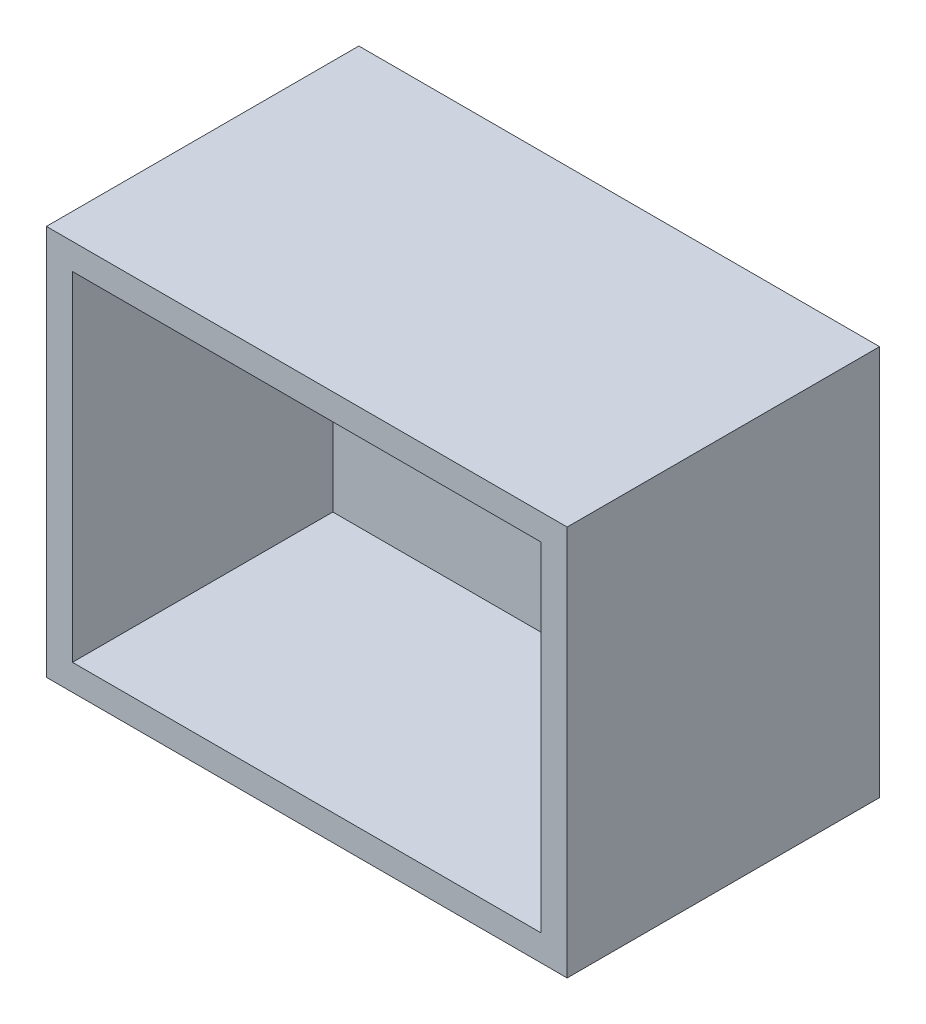
ISO-10303-21;
HEADER;
FILE_DESCRIPTION(('STEP AP214'),'2;1');
FILE_NAME('part.step','',(''),(''),'','','');
FILE_SCHEMA(('AUTOMOTIVE_DESIGN { 1 0 10303 214 1 1 1 1 }'));
ENDSEC;
DATA;
#1=APPLICATION_CONTEXT('core data for automotive mechanical design processes');
#2=APPLICATION_PROTOCOL_DEFINITION('international standard','automotive_design',2000,#1);
#3=PRODUCT_CONTEXT('',#1,'mechanical');
#4=PRODUCT('Part','Part','',(#3));
#5=PRODUCT_RELATED_PRODUCT_CATEGORY('part','',(#4));
#6=PRODUCT_DEFINITION_FORMATION('','',#4);
#7=PRODUCT_DEFINITION_CONTEXT('part definition',#1,'design');
#8=PRODUCT_DEFINITION('design','',#6,#7);
#9=PRODUCT_DEFINITION_SHAPE('','',#8);
#10=(LENGTH_UNIT() NAMED_UNIT(*) SI_UNIT(.MILLI.,.METRE.));
#11=(NAMED_UNIT(*) PLANE_ANGLE_UNIT() SI_UNIT($,.RADIAN.));
#12=(NAMED_UNIT(*) SI_UNIT($,.STERADIAN.) SOLID_ANGLE_UNIT());
#13=UNCERTAINTY_MEASURE_WITH_UNIT(LENGTH_MEASURE(1.E-05),#10,'distance_accuracy_value','');
#14=(GEOMETRIC_REPRESENTATION_CONTEXT(3) GLOBAL_UNCERTAINTY_ASSIGNED_CONTEXT((#13)) GLOBAL_UNIT_ASSIGNED_CONTEXT((#10,
#11,#12)) REPRESENTATION_CONTEXT('',''));
#15=CARTESIAN_POINT('',(0.,0.,0.));
#16=DIRECTION('',(0.,0.,1.));
#17=DIRECTION('',(1.,0.,0.));
#18=AXIS2_PLACEMENT_3D('',#15,#16,#17);
#19=CARTESIAN_POINT('',(-100.,75.,120.));
#20=DIRECTION('',(1.,0.,0.));
#21=DIRECTION('',(0.,1.,0.));
#22=AXIS2_PLACEMENT_3D('',#19,#20,#21);
#23=PLANE('',#22);
#24=DIRECTION('',(0.,-1.,0.));
#25=VECTOR('',#24,1.);
#26=CARTESIAN_POINT('',(-100.,75.,0.));
#27=LINE('',#26,#25);
#28=CARTESIAN_POINT('',(-100.,75.,0.));
#29=VERTEX_POINT('',#28);
#30=CARTESIAN_POINT('',(-100.,-75.,0.));
#31=VERTEX_POINT('',#30);
#32=EDGE_CURVE('E163',#29,#31,#27,.T.);
#33=ORIENTED_EDGE('',*,*,#32,.T.);
#34=DIRECTION('',(0.,0.,-1.));
#35=VECTOR('',#34,1.);
#36=CARTESIAN_POINT('',(-100.,-75.,120.));
#37=LINE('',#36,#35);
#38=CARTESIAN_POINT('',(-100.,-75.,120.));
#39=VERTEX_POINT('',#38);
#40=EDGE_CURVE('E11',#39,#31,#37,.T.);
#41=ORIENTED_EDGE('',*,*,#40,.F.);
#42=DIRECTION('',(0.,-1.,0.));
#43=VECTOR('',#42,1.);
#44=CARTESIAN_POINT('',(-100.,75.,120.));
#45=LINE('',#44,#43);
#46=CARTESIAN_POINT('',(-100.,75.,120.));
#47=VERTEX_POINT('',#46);
#48=EDGE_CURVE('E168',#47,#39,#45,.T.);
#49=ORIENTED_EDGE('',*,*,#48,.F.);
#50=DIRECTION('',(0.,0.,-1.));
#51=VECTOR('',#50,1.);
#52=CARTESIAN_POINT('',(-100.,75.,120.));
#53=LINE('',#52,#51);
#54=EDGE_CURVE('E178',#47,#29,#53,.T.);
#55=ORIENTED_EDGE('',*,*,#54,.T.);
#56=EDGE_LOOP('',(#33,#41,#49,#55));
#57=FACE_BOUND('',#56,.T.);
#58=ADVANCED_FACE('F38',(#57),#23,.F.);
#59=CARTESIAN_POINT('',(-100.,-75.,120.));
#60=DIRECTION('',(0.,1.,0.));
#61=DIRECTION('',(-1.,0.,0.));
#62=AXIS2_PLACEMENT_3D('',#59,#60,#61);
#63=PLANE('',#62);
#64=DIRECTION('',(1.,0.,0.));
#65=VECTOR('',#64,1.);
#66=CARTESIAN_POINT('',(-100.,-75.,0.));
#67=LINE('',#66,#65);
#68=CARTESIAN_POINT('',(100.,-75.,0.));
#69=VERTEX_POINT('',#68);
#70=EDGE_CURVE('E181',#31,#69,#67,.T.);
#71=ORIENTED_EDGE('',*,*,#70,.T.);
#72=DIRECTION('',(0.,0.,-1.));
#73=VECTOR('',#72,1.);
#74=CARTESIAN_POINT('',(100.,-75.,120.));
#75=LINE('',#74,#73);
#76=CARTESIAN_POINT('',(100.,-75.,120.));
#77=VERTEX_POINT('',#76);
#78=EDGE_CURVE('E46',#77,#69,#75,.T.);
#79=ORIENTED_EDGE('',*,*,#78,.F.);
#80=DIRECTION('',(1.,0.,0.));
#81=VECTOR('',#80,1.);
#82=CARTESIAN_POINT('',(-100.,-75.,120.));
#83=LINE('',#82,#81);
#84=EDGE_CURVE('E96',#39,#77,#83,.T.);
#85=ORIENTED_EDGE('',*,*,#84,.F.);
#86=ORIENTED_EDGE('',*,*,#40,.T.);
#87=EDGE_LOOP('',(#71,#79,#85,#86));
#88=FACE_BOUND('',#87,.T.);
#89=ADVANCED_FACE('F216',(#88),#63,.F.);
#90=CARTESIAN_POINT('',(100.,75.,120.));
#91=DIRECTION('',(-1.,0.,0.));
#92=DIRECTION('',(0.,-1.,0.));
#93=AXIS2_PLACEMENT_3D('',#90,#91,#92);
#94=PLANE('',#93);
#95=DIRECTION('',(0.,1.,0.));
#96=VECTOR('',#95,1.);
#97=CARTESIAN_POINT('',(100.,75.,0.));
#98=LINE('',#97,#96);
#99=CARTESIAN_POINT('',(100.,75.,0.));
#100=VERTEX_POINT('',#99);
#101=EDGE_CURVE('E184',#69,#100,#98,.T.);
#102=ORIENTED_EDGE('',*,*,#101,.T.);
#103=DIRECTION('',(0.,0.,-1.));
#104=VECTOR('',#103,1.);
#105=CARTESIAN_POINT('',(100.,75.,120.));
#106=LINE('',#105,#104);
#107=CARTESIAN_POINT('',(100.,75.,120.));
#108=VERTEX_POINT('',#107);
#109=EDGE_CURVE('E191',#108,#100,#106,.T.);
#110=ORIENTED_EDGE('',*,*,#109,.F.);
#111=DIRECTION('',(0.,1.,0.));
#112=VECTOR('',#111,1.);
#113=CARTESIAN_POINT('',(100.,75.,120.));
#114=LINE('',#113,#112);
#115=EDGE_CURVE('E173',#77,#108,#114,.T.);
#116=ORIENTED_EDGE('',*,*,#115,.F.);
#117=ORIENTED_EDGE('',*,*,#78,.T.);
#118=EDGE_LOOP('',(#102,#110,#116,#117));
#119=FACE_BOUND('',#118,.T.);
#120=ADVANCED_FACE('F197',(#119),#94,.F.);
#121=CARTESIAN_POINT('',(-100.,75.,120.));
#122=DIRECTION('',(0.,-1.,0.));
#123=DIRECTION('',(1.,0.,0.));
#124=AXIS2_PLACEMENT_3D('',#121,#122,#123);
#125=PLANE('',#124);
#126=DIRECTION('',(-1.,0.,0.));
#127=VECTOR('',#126,1.);
#128=CARTESIAN_POINT('',(-100.,75.,0.));
#129=LINE('',#128,#127);
#130=EDGE_CURVE('E89',#100,#29,#129,.T.);
#131=ORIENTED_EDGE('',*,*,#130,.T.);
#132=ORIENTED_EDGE('',*,*,#54,.F.);
#133=DIRECTION('',(-1.,0.,0.));
#134=VECTOR('',#133,1.);
#135=CARTESIAN_POINT('',(-100.,75.,120.));
#136=LINE('',#135,#134);
#137=EDGE_CURVE('E67',#108,#47,#136,.T.);
#138=ORIENTED_EDGE('',*,*,#137,.F.);
#139=ORIENTED_EDGE('',*,*,#109,.T.);
#140=EDGE_LOOP('',(#131,#132,#138,#139));
#141=FACE_BOUND('',#140,.T.);
#142=ADVANCED_FACE('F205',(#141),#125,.F.);
#143=CARTESIAN_POINT('',(0.,0.,120.));
#144=DIRECTION('',(0.,0.,1.));
#145=DIRECTION('',(1.,0.,0.));
#146=AXIS2_PLACEMENT_3D('',#143,#144,#145);
#147=PLANE('',#146);
#148=DIRECTION('',(0.,-1.,0.));
#149=VECTOR('',#148,1.);
#150=CARTESIAN_POINT('',(-90.,65.,120.));
#151=LINE('',#150,#149);
#152=CARTESIAN_POINT('',(-90.,65.,120.));
#153=VERTEX_POINT('',#152);
#154=CARTESIAN_POINT('',(-90.,-65.,120.));
#155=VERTEX_POINT('',#154);
#156=EDGE_CURVE('E56',#153,#155,#151,.T.);
#157=ORIENTED_EDGE('',*,*,#156,.F.);
#158=DIRECTION('',(-1.,0.,0.));
#159=VECTOR('',#158,1.);
#160=CARTESIAN_POINT('',(-90.,65.,120.));
#161=LINE('',#160,#159);
#162=CARTESIAN_POINT('',(90.,65.,120.));
#163=VERTEX_POINT('',#162);
#164=EDGE_CURVE('E141',#163,#153,#161,.T.);
#165=ORIENTED_EDGE('',*,*,#164,.F.);
#166=DIRECTION('',(0.,1.,0.));
#167=VECTOR('',#166,1.);
#168=CARTESIAN_POINT('',(90.,65.,120.));
#169=LINE('',#168,#167);
#170=CARTESIAN_POINT('',(90.,-65.,120.));
#171=VERTEX_POINT('',#170);
#172=EDGE_CURVE('E146',#171,#163,#169,.T.);
#173=ORIENTED_EDGE('',*,*,#172,.F.);
#174=DIRECTION('',(1.,0.,0.));
#175=VECTOR('',#174,1.);
#176=CARTESIAN_POINT('',(-90.,-65.,120.));
#177=LINE('',#176,#175);
#178=EDGE_CURVE('E154',#155,#171,#177,.T.);
#179=ORIENTED_EDGE('',*,*,#178,.F.);
#180=EDGE_LOOP('',(#157,#165,#173,#179));
#181=FACE_BOUND('',#180,.T.);
#182=ORIENTED_EDGE('',*,*,#48,.T.);
#183=ORIENTED_EDGE('',*,*,#84,.T.);
#184=ORIENTED_EDGE('',*,*,#115,.T.);
#185=ORIENTED_EDGE('',*,*,#137,.T.);
#186=EDGE_LOOP('',(#182,#183,#184,#185));
#187=FACE_BOUND('',#186,.T.);
#188=ADVANCED_FACE('F207',(#181,#187),#147,.T.);
#189=CARTESIAN_POINT('',(0.,0.,0.));
#190=DIRECTION('',(0.,0.,1.));
#191=DIRECTION('',(1.,0.,0.));
#192=AXIS2_PLACEMENT_3D('',#189,#190,#191);
#193=PLANE('',#192);
#194=ORIENTED_EDGE('',*,*,#32,.F.);
#195=ORIENTED_EDGE('',*,*,#130,.F.);
#196=ORIENTED_EDGE('',*,*,#101,.F.);
#197=ORIENTED_EDGE('',*,*,#70,.F.);
#198=EDGE_LOOP('',(#194,#195,#196,#197));
#199=FACE_BOUND('',#198,.T.);
#200=ADVANCED_FACE('F201',(#199),#193,.F.);
#201=CARTESIAN_POINT('',(-90.,65.,20.));
#202=DIRECTION('',(-1.,0.,0.));
#203=DIRECTION('',(0.,0.,1.));
#204=AXIS2_PLACEMENT_3D('',#201,#202,#203);
#205=PLANE('',#204);
#206=ORIENTED_EDGE('',*,*,#156,.T.);
#207=DIRECTION('',(0.,0.,1.));
#208=VECTOR('',#207,1.);
#209=CARTESIAN_POINT('',(-90.,-65.,20.));
#210=LINE('',#209,#208);
#211=CARTESIAN_POINT('',(-90.,-65.,20.));
#212=VERTEX_POINT('',#211);
#213=EDGE_CURVE('E116',#212,#155,#210,.T.);
#214=ORIENTED_EDGE('',*,*,#213,.F.);
#215=DIRECTION('',(0.,-1.,0.));
#216=VECTOR('',#215,1.);
#217=CARTESIAN_POINT('',(-90.,65.,20.));
#218=LINE('',#217,#216);
#219=CARTESIAN_POINT('',(-90.,65.,20.));
#220=VERTEX_POINT('',#219);
#221=EDGE_CURVE('E120',#220,#212,#218,.T.);
#222=ORIENTED_EDGE('',*,*,#221,.F.);
#223=DIRECTION('',(0.,0.,1.));
#224=VECTOR('',#223,1.);
#225=CARTESIAN_POINT('',(-90.,65.,20.));
#226=LINE('',#225,#224);
#227=EDGE_CURVE('E160',#220,#153,#226,.T.);
#228=ORIENTED_EDGE('',*,*,#227,.T.);
#229=EDGE_LOOP('',(#206,#214,#222,#228));
#230=FACE_BOUND('',#229,.T.);
#231=ADVANCED_FACE('F118',(#230),#205,.F.);
#232=CARTESIAN_POINT('',(-90.,65.,20.));
#233=DIRECTION('',(0.,1.,0.));
#234=DIRECTION('',(0.,0.,1.));
#235=AXIS2_PLACEMENT_3D('',#232,#233,#234);
#236=PLANE('',#235);
#237=ORIENTED_EDGE('',*,*,#164,.T.);
#238=ORIENTED_EDGE('',*,*,#227,.F.);
#239=DIRECTION('',(-1.,0.,0.));
#240=VECTOR('',#239,1.);
#241=CARTESIAN_POINT('',(-90.,65.,20.));
#242=LINE('',#241,#240);
#243=CARTESIAN_POINT('',(90.,65.,20.));
#244=VERTEX_POINT('',#243);
#245=EDGE_CURVE('E127',#244,#220,#242,.T.);
#246=ORIENTED_EDGE('',*,*,#245,.F.);
#247=DIRECTION('',(0.,0.,1.));
#248=VECTOR('',#247,1.);
#249=CARTESIAN_POINT('',(90.,65.,20.));
#250=LINE('',#249,#248);
#251=EDGE_CURVE('E164',#244,#163,#250,.T.);
#252=ORIENTED_EDGE('',*,*,#251,.T.);
#253=EDGE_LOOP('',(#237,#238,#246,#252));
#254=FACE_BOUND('',#253,.T.);
#255=ADVANCED_FACE('F243',(#254),#236,.F.);
#256=CARTESIAN_POINT('',(90.,65.,20.));
#257=DIRECTION('',(1.,0.,0.));
#258=DIRECTION('',(0.,0.,-1.));
#259=AXIS2_PLACEMENT_3D('',#256,#257,#258);
#260=PLANE('',#259);
#261=ORIENTED_EDGE('',*,*,#172,.T.);
#262=ORIENTED_EDGE('',*,*,#251,.F.);
#263=DIRECTION('',(0.,1.,0.));
#264=VECTOR('',#263,1.);
#265=CARTESIAN_POINT('',(90.,65.,20.));
#266=LINE('',#265,#264);
#267=CARTESIAN_POINT('',(90.,-65.,20.));
#268=VERTEX_POINT('',#267);
#269=EDGE_CURVE('E136',#268,#244,#266,.T.);
#270=ORIENTED_EDGE('',*,*,#269,.F.);
#271=DIRECTION('',(0.,0.,1.));
#272=VECTOR('',#271,1.);
#273=CARTESIAN_POINT('',(90.,-65.,20.));
#274=LINE('',#273,#272);
#275=EDGE_CURVE('E126',#268,#171,#274,.T.);
#276=ORIENTED_EDGE('',*,*,#275,.T.);
#277=EDGE_LOOP('',(#261,#262,#270,#276));
#278=FACE_BOUND('',#277,.T.);
#279=ADVANCED_FACE('F241',(#278),#260,.F.);
#280=CARTESIAN_POINT('',(-90.,-65.,20.));
#281=DIRECTION('',(0.,-1.,0.));
#282=DIRECTION('',(0.,0.,-1.));
#283=AXIS2_PLACEMENT_3D('',#280,#281,#282);
#284=PLANE('',#283);
#285=ORIENTED_EDGE('',*,*,#178,.T.);
#286=ORIENTED_EDGE('',*,*,#275,.F.);
#287=DIRECTION('',(1.,0.,0.));
#288=VECTOR('',#287,1.);
#289=CARTESIAN_POINT('',(-90.,-65.,20.));
#290=LINE('',#289,#288);
#291=EDGE_CURVE('E130',#212,#268,#290,.T.);
#292=ORIENTED_EDGE('',*,*,#291,.F.);
#293=ORIENTED_EDGE('',*,*,#213,.T.);
#294=EDGE_LOOP('',(#285,#286,#292,#293));
#295=FACE_BOUND('',#294,.T.);
#296=ADVANCED_FACE('F131',(#295),#284,.F.);
#297=CARTESIAN_POINT('',(0.,0.,20.));
#298=DIRECTION('',(0.,0.,1.));
#299=DIRECTION('',(1.,0.,0.));
#300=AXIS2_PLACEMENT_3D('',#297,#298,#299);
#301=PLANE('',#300);
#302=ORIENTED_EDGE('',*,*,#221,.T.);
#303=ORIENTED_EDGE('',*,*,#291,.T.);
#304=ORIENTED_EDGE('',*,*,#269,.T.);
#305=ORIENTED_EDGE('',*,*,#245,.T.);
#306=EDGE_LOOP('',(#302,#303,#304,#305));
#307=FACE_BOUND('',#306,.T.);
#308=ADVANCED_FACE('F138',(#307),#301,.T.);
#309=CLOSED_SHELL('',(#58,#89,#120,#142,#188,#200,#231,#255,#279,#296,#308));
#310=MANIFOLD_SOLID_BREP('B2',#309);
#311=ADVANCED_BREP_SHAPE_REPRESENTATION('',(#18,#310),#14);
#312=SHAPE_DEFINITION_REPRESENTATION(#9,#311);
ENDSEC;
END-ISO-10303-21;
